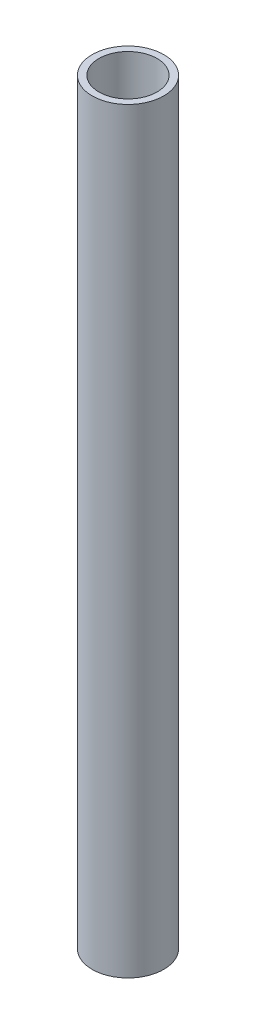
ISO-10303-21;
HEADER;
FILE_DESCRIPTION(('STEP AP214'),'2;1');
FILE_NAME('part.step','',(''),(''),'','','');
FILE_SCHEMA(('AUTOMOTIVE_DESIGN { 1 0 10303 214 1 1 1 1 }'));
ENDSEC;
DATA;
#1=APPLICATION_CONTEXT('core data for automotive mechanical design processes');
#2=APPLICATION_PROTOCOL_DEFINITION('international standard','automotive_design',2000,#1);
#3=PRODUCT_CONTEXT('',#1,'mechanical');
#4=PRODUCT('Part','Part','',(#3));
#5=PRODUCT_RELATED_PRODUCT_CATEGORY('part','',(#4));
#6=PRODUCT_DEFINITION_FORMATION('','',#4);
#7=PRODUCT_DEFINITION_CONTEXT('part definition',#1,'design');
#8=PRODUCT_DEFINITION('design','',#6,#7);
#9=PRODUCT_DEFINITION_SHAPE('','',#8);
#10=(LENGTH_UNIT() NAMED_UNIT(*) SI_UNIT(.MILLI.,.METRE.));
#11=(NAMED_UNIT(*) PLANE_ANGLE_UNIT() SI_UNIT($,.RADIAN.));
#12=(NAMED_UNIT(*) SI_UNIT($,.STERADIAN.) SOLID_ANGLE_UNIT());
#13=UNCERTAINTY_MEASURE_WITH_UNIT(LENGTH_MEASURE(1.E-05),#10,'distance_accuracy_value','');
#14=(GEOMETRIC_REPRESENTATION_CONTEXT(3) GLOBAL_UNCERTAINTY_ASSIGNED_CONTEXT((#13)) GLOBAL_UNIT_ASSIGNED_CONTEXT((#10,
#11,#12)) REPRESENTATION_CONTEXT('',''));
#15=CARTESIAN_POINT('',(0.,0.,0.));
#16=DIRECTION('',(0.,0.,1.));
#17=DIRECTION('',(1.,0.,0.));
#18=AXIS2_PLACEMENT_3D('',#15,#16,#17);
#19=CARTESIAN_POINT('',(2.45914399954472E-11,225.,1.50000000000001));
#20=DIRECTION('',(0.,1.,0.));
#21=DIRECTION('',(0.,0.,1.));
#22=AXIS2_PLACEMENT_3D('',#19,#20,#21);
#23=PLANE('',#22);
#24=CARTESIAN_POINT('',(2.45914399954472E-11,225.,1.50000000000001));
#25=DIRECTION('',(0.,1.,0.));
#26=DIRECTION('',(0.,0.,1.));
#27=AXIS2_PLACEMENT_3D('',#24,#25,#26);
#28=CIRCLE('',#27,10.65);
#29=CARTESIAN_POINT('',(2.45914399954472E-11,225.,12.15));
#30=VERTEX_POINT('',#29);
#31=EDGE_CURVE('E10',#30,#30,#28,.T.);
#32=ORIENTED_EDGE('',*,*,#31,.T.);
#33=EDGE_LOOP('',(#32));
#34=FACE_BOUND('',#33,.T.);
#35=CARTESIAN_POINT('',(2.45914399954472E-11,225.,1.50000000000001));
#36=DIRECTION('',(0.,1.,0.));
#37=DIRECTION('',(0.,0.,1.));
#38=AXIS2_PLACEMENT_3D('',#35,#36,#37);
#39=CIRCLE('',#38,8.65);
#40=CARTESIAN_POINT('',(2.45914399954472E-11,225.,10.15));
#41=VERTEX_POINT('',#40);
#42=EDGE_CURVE('E42',#41,#41,#39,.T.);
#43=ORIENTED_EDGE('',*,*,#42,.F.);
#44=EDGE_LOOP('',(#43));
#45=FACE_BOUND('',#44,.T.);
#46=ADVANCED_FACE('F31',(#34,#45),#23,.T.);
#47=CARTESIAN_POINT('',(2.45914399954472E-11,0.,1.50000000000001));
#48=DIRECTION('',(0.,1.,0.));
#49=DIRECTION('',(0.,0.,1.));
#50=AXIS2_PLACEMENT_3D('',#47,#48,#49);
#51=PLANE('',#50);
#52=CARTESIAN_POINT('',(2.45914399954472E-11,0.,1.50000000000001));
#53=DIRECTION('',(0.,1.,0.));
#54=DIRECTION('',(0.,0.,1.));
#55=AXIS2_PLACEMENT_3D('',#52,#53,#54);
#56=CIRCLE('',#55,10.65);
#57=CARTESIAN_POINT('',(2.45914399954472E-11,0.,12.15));
#58=VERTEX_POINT('',#57);
#59=EDGE_CURVE('E35',#58,#58,#56,.T.);
#60=ORIENTED_EDGE('',*,*,#59,.F.);
#61=EDGE_LOOP('',(#60));
#62=FACE_BOUND('',#61,.T.);
#63=CARTESIAN_POINT('',(2.45914399954472E-11,0.,1.50000000000001));
#64=DIRECTION('',(0.,1.,0.));
#65=DIRECTION('',(0.,0.,1.));
#66=AXIS2_PLACEMENT_3D('',#63,#64,#65);
#67=CIRCLE('',#66,8.65);
#68=CARTESIAN_POINT('',(2.45914399954472E-11,0.,10.15));
#69=VERTEX_POINT('',#68);
#70=EDGE_CURVE('E44',#69,#69,#67,.T.);
#71=ORIENTED_EDGE('',*,*,#70,.T.);
#72=EDGE_LOOP('',(#71));
#73=FACE_BOUND('',#72,.T.);
#74=ADVANCED_FACE('F54',(#62,#73),#51,.F.);
#75=CARTESIAN_POINT('',(2.45914399954472E-11,225.,1.50000000000001));
#76=DIRECTION('',(0.,-1.,0.));
#77=DIRECTION('',(0.,0.,-1.));
#78=AXIS2_PLACEMENT_3D('',#75,#76,#77);
#79=CYLINDRICAL_SURFACE('',#78,10.65);
#80=ORIENTED_EDGE('',*,*,#31,.F.);
#81=EDGE_LOOP('',(#80));
#82=FACE_BOUND('',#81,.T.);
#83=ORIENTED_EDGE('',*,*,#59,.T.);
#84=EDGE_LOOP('',(#83));
#85=FACE_BOUND('',#84,.T.);
#86=ADVANCED_FACE('F33',(#82,#85),#79,.T.);
#87=CARTESIAN_POINT('',(2.45914399954472E-11,225.,1.50000000000001));
#88=DIRECTION('',(0.,-1.,0.));
#89=DIRECTION('',(0.,0.,-1.));
#90=AXIS2_PLACEMENT_3D('',#87,#88,#89);
#91=CYLINDRICAL_SURFACE('',#90,8.65);
#92=ORIENTED_EDGE('',*,*,#42,.T.);
#93=EDGE_LOOP('',(#92));
#94=FACE_BOUND('',#93,.T.);
#95=ORIENTED_EDGE('',*,*,#70,.F.);
#96=EDGE_LOOP('',(#95));
#97=FACE_BOUND('',#96,.T.);
#98=ADVANCED_FACE('F50',(#94,#97),#91,.F.);
#99=CLOSED_SHELL('',(#46,#74,#86,#98));
#100=MANIFOLD_SOLID_BREP('B2',#99);
#101=ADVANCED_BREP_SHAPE_REPRESENTATION('',(#18,#100),#14);
#102=SHAPE_DEFINITION_REPRESENTATION(#9,#101);
ENDSEC;
END-ISO-10303-21;
